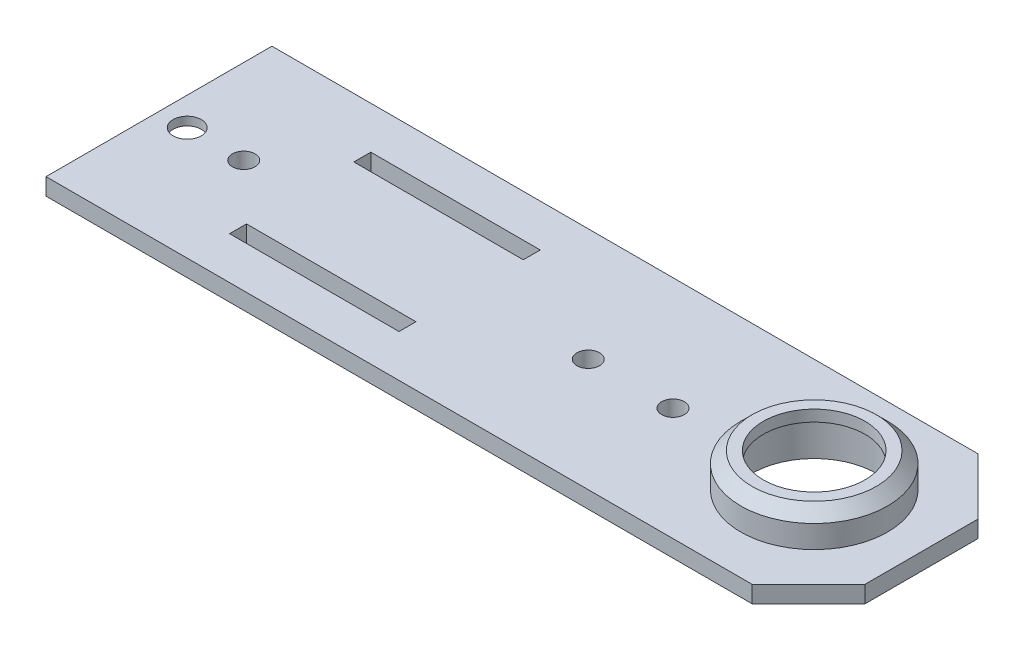
ISO-10303-21;
HEADER;
FILE_DESCRIPTION(('STEP AP214'),'2;1');
FILE_NAME('part.step','',(''),(''),'','','');
FILE_SCHEMA(('AUTOMOTIVE_DESIGN { 1 0 10303 214 1 1 1 1 }'));
ENDSEC;
DATA;
#1=APPLICATION_CONTEXT('core data for automotive mechanical design processes');
#2=APPLICATION_PROTOCOL_DEFINITION('international standard','automotive_design',2000,#1);
#3=PRODUCT_CONTEXT('',#1,'mechanical');
#4=PRODUCT('Part','Part','',(#3));
#5=PRODUCT_RELATED_PRODUCT_CATEGORY('part','',(#4));
#6=PRODUCT_DEFINITION_FORMATION('','',#4);
#7=PRODUCT_DEFINITION_CONTEXT('part definition',#1,'design');
#8=PRODUCT_DEFINITION('design','',#6,#7);
#9=PRODUCT_DEFINITION_SHAPE('','',#8);
#10=(LENGTH_UNIT() NAMED_UNIT(*) SI_UNIT(.MILLI.,.METRE.));
#11=(NAMED_UNIT(*) PLANE_ANGLE_UNIT() SI_UNIT($,.RADIAN.));
#12=(NAMED_UNIT(*) SI_UNIT($,.STERADIAN.) SOLID_ANGLE_UNIT());
#13=UNCERTAINTY_MEASURE_WITH_UNIT(LENGTH_MEASURE(1.E-05),#10,'distance_accuracy_value','');
#14=(GEOMETRIC_REPRESENTATION_CONTEXT(3) GLOBAL_UNCERTAINTY_ASSIGNED_CONTEXT((#13)) GLOBAL_UNIT_ASSIGNED_CONTEXT((#10,
#11,#12)) REPRESENTATION_CONTEXT('',''));
#15=CARTESIAN_POINT('',(0.,0.,0.));
#16=DIRECTION('',(0.,0.,1.));
#17=DIRECTION('',(1.,0.,0.));
#18=AXIS2_PLACEMENT_3D('',#15,#16,#17);
#19=CARTESIAN_POINT('',(-57.5,3.,-10.0000000000001));
#20=DIRECTION('',(0.,0.,-1.));
#21=DIRECTION('',(-1.,0.,0.));
#22=AXIS2_PLACEMENT_3D('',#19,#20,#21);
#23=PLANE('',#22);
#24=DIRECTION('',(-1.,0.,0.));
#25=VECTOR('',#24,1.);
#26=CARTESIAN_POINT('',(-67.5,1.5,-10.0000000000001));
#27=LINE('',#26,#25);
#28=CARTESIAN_POINT('',(-57.5,1.5,-10.0000000000001));
#29=VERTEX_POINT('',#28);
#30=CARTESIAN_POINT('',(-67.5,1.5,-10.0000000000001));
#31=VERTEX_POINT('',#30);
#32=EDGE_CURVE('E171',#29,#31,#27,.T.);
#33=ORIENTED_EDGE('',*,*,#32,.T.);
#34=DIRECTION('',(0.,-1.,0.));
#35=VECTOR('',#34,1.);
#36=CARTESIAN_POINT('',(-67.5,3.,-10.0000000000001));
#37=LINE('',#36,#35);
#38=CARTESIAN_POINT('',(-67.5,0.,-10.0000000000001));
#39=VERTEX_POINT('',#38);
#40=EDGE_CURVE('E189',#31,#39,#37,.T.);
#41=ORIENTED_EDGE('',*,*,#40,.T.);
#42=DIRECTION('',(1.,0.,0.));
#43=VECTOR('',#42,1.);
#44=CARTESIAN_POINT('',(-57.5,0.,-10.0000000000001));
#45=LINE('',#44,#43);
#46=CARTESIAN_POINT('',(-57.5,0.,-10.0000000000001));
#47=VERTEX_POINT('',#46);
#48=EDGE_CURVE('E267',#39,#47,#45,.T.);
#49=ORIENTED_EDGE('',*,*,#48,.T.);
#50=DIRECTION('',(0.,-1.,0.));
#51=VECTOR('',#50,1.);
#52=CARTESIAN_POINT('',(-57.5,3.,-10.0000000000001));
#53=LINE('',#52,#51);
#54=EDGE_CURVE('E187',#29,#47,#53,.T.);
#55=ORIENTED_EDGE('',*,*,#54,.F.);
#56=EDGE_LOOP('',(#33,#41,#49,#55));
#57=FACE_BOUND('',#56,.T.);
#58=ADVANCED_FACE('F39',(#57),#23,.F.);
#59=CARTESIAN_POINT('',(-57.5,3.,9.99999999999992));
#60=DIRECTION('',(1.,0.,0.));
#61=DIRECTION('',(0.,0.,-1.));
#62=AXIS2_PLACEMENT_3D('',#59,#60,#61);
#63=PLANE('',#62);
#64=DIRECTION('',(0.,0.,-1.));
#65=VECTOR('',#64,1.);
#66=CARTESIAN_POINT('',(-57.5,1.5,-10.0000000000001));
#67=LINE('',#66,#65);
#68=CARTESIAN_POINT('',(-57.5,1.5,9.99999999999992));
#69=VERTEX_POINT('',#68);
#70=EDGE_CURVE('E165',#69,#29,#67,.T.);
#71=ORIENTED_EDGE('',*,*,#70,.T.);
#72=ORIENTED_EDGE('',*,*,#54,.T.);
#73=DIRECTION('',(0.,0.,1.));
#74=VECTOR('',#73,1.);
#75=CARTESIAN_POINT('',(-57.5,0.,9.99999999999992));
#76=LINE('',#75,#74);
#77=CARTESIAN_POINT('',(-57.5,0.,9.99999999999992));
#78=VERTEX_POINT('',#77);
#79=EDGE_CURVE('E185',#47,#78,#76,.T.);
#80=ORIENTED_EDGE('',*,*,#79,.T.);
#81=DIRECTION('',(0.,-1.,0.));
#82=VECTOR('',#81,1.);
#83=CARTESIAN_POINT('',(-57.5,3.,9.99999999999992));
#84=LINE('',#83,#82);
#85=EDGE_CURVE('E179',#69,#78,#84,.T.);
#86=ORIENTED_EDGE('',*,*,#85,.F.);
#87=EDGE_LOOP('',(#71,#72,#80,#86));
#88=FACE_BOUND('',#87,.T.);
#89=ADVANCED_FACE('F183',(#88),#63,.F.);
#90=CARTESIAN_POINT('',(-67.5,3.,9.99999999999992));
#91=DIRECTION('',(0.,0.,1.));
#92=DIRECTION('',(1.,0.,0.));
#93=AXIS2_PLACEMENT_3D('',#90,#91,#92);
#94=PLANE('',#93);
#95=DIRECTION('',(1.,0.,0.));
#96=VECTOR('',#95,1.);
#97=CARTESIAN_POINT('',(-67.5,1.5,9.99999999999992));
#98=LINE('',#97,#96);
#99=CARTESIAN_POINT('',(-67.5,1.5,9.99999999999992));
#100=VERTEX_POINT('',#99);
#101=EDGE_CURVE('E168',#100,#69,#98,.T.);
#102=ORIENTED_EDGE('',*,*,#101,.T.);
#103=ORIENTED_EDGE('',*,*,#85,.T.);
#104=DIRECTION('',(-1.,0.,0.));
#105=VECTOR('',#104,1.);
#106=CARTESIAN_POINT('',(-67.5,0.,9.99999999999992));
#107=LINE('',#106,#105);
#108=CARTESIAN_POINT('',(-67.5,0.,9.99999999999992));
#109=VERTEX_POINT('',#108);
#110=EDGE_CURVE('E252',#78,#109,#107,.T.);
#111=ORIENTED_EDGE('',*,*,#110,.T.);
#112=DIRECTION('',(0.,-1.,0.));
#113=VECTOR('',#112,1.);
#114=CARTESIAN_POINT('',(-67.5,3.,9.99999999999992));
#115=LINE('',#114,#113);
#116=EDGE_CURVE('E181',#100,#109,#115,.T.);
#117=ORIENTED_EDGE('',*,*,#116,.F.);
#118=EDGE_LOOP('',(#102,#103,#111,#117));
#119=FACE_BOUND('',#118,.T.);
#120=ADVANCED_FACE('F177',(#119),#94,.F.);
#121=CARTESIAN_POINT('',(0.,3.,0.));
#122=DIRECTION('',(0.,-1.,0.));
#123=DIRECTION('',(0.,0.,-1.));
#124=AXIS2_PLACEMENT_3D('',#121,#122,#123);
#125=PLANE('',#124);
#126=DIRECTION('',(0.,0.,-1.));
#127=VECTOR('',#126,1.);
#128=CARTESIAN_POINT('',(-12.5,3.,12.5));
#129=LINE('',#128,#127);
#130=CARTESIAN_POINT('',(-12.5,3.,12.5));
#131=VERTEX_POINT('',#130);
#132=CARTESIAN_POINT('',(-12.5,3.,9.5));
#133=VERTEX_POINT('',#132);
#134=EDGE_CURVE('E292',#131,#133,#129,.T.);
#135=ORIENTED_EDGE('',*,*,#134,.F.);
#136=DIRECTION('',(1.,0.,0.));
#137=VECTOR('',#136,1.);
#138=CARTESIAN_POINT('',(-42.5,3.,12.5));
#139=LINE('',#138,#137);
#140=CARTESIAN_POINT('',(-42.5,3.,12.5));
#141=VERTEX_POINT('',#140);
#142=EDGE_CURVE('E300',#141,#131,#139,.T.);
#143=ORIENTED_EDGE('',*,*,#142,.F.);
#144=DIRECTION('',(0.,0.,1.));
#145=VECTOR('',#144,1.);
#146=CARTESIAN_POINT('',(-42.5,3.,12.5));
#147=LINE('',#146,#145);
#148=CARTESIAN_POINT('',(-42.5,3.,9.5));
#149=VERTEX_POINT('',#148);
#150=EDGE_CURVE('E297',#149,#141,#147,.T.);
#151=ORIENTED_EDGE('',*,*,#150,.F.);
#152=DIRECTION('',(-1.,0.,0.));
#153=VECTOR('',#152,1.);
#154=CARTESIAN_POINT('',(-42.5,3.,9.5));
#155=LINE('',#154,#153);
#156=EDGE_CURVE('E294',#133,#149,#155,.T.);
#157=ORIENTED_EDGE('',*,*,#156,.F.);
#158=EDGE_LOOP('',(#135,#143,#151,#157));
#159=FACE_BOUND('',#158,.T.);
#160=CARTESIAN_POINT('',(8.49999999999999,3.,0.));
#161=DIRECTION('',(0.,1.,0.));
#162=DIRECTION('',(0.,0.,1.));
#163=AXIS2_PLACEMENT_3D('',#160,#161,#162);
#164=CIRCLE('',#163,2.);
#165=CARTESIAN_POINT('',(8.49999999999999,3.,2.));
#166=VERTEX_POINT('',#165);
#167=EDGE_CURVE('E363',#166,#166,#164,.T.);
#168=ORIENTED_EDGE('',*,*,#167,.F.);
#169=EDGE_LOOP('',(#168));
#170=FACE_BOUND('',#169,.T.);
#171=CARTESIAN_POINT('',(23.5,3.,0.));
#172=DIRECTION('',(0.,1.,0.));
#173=DIRECTION('',(0.,0.,1.));
#174=AXIS2_PLACEMENT_3D('',#171,#172,#173);
#175=CIRCLE('',#174,2.);
#176=CARTESIAN_POINT('',(23.5,3.,2.00000000000001));
#177=VERTEX_POINT('',#176);
#178=EDGE_CURVE('E262',#177,#177,#175,.T.);
#179=ORIENTED_EDGE('',*,*,#178,.F.);
#180=EDGE_LOOP('',(#179));
#181=FACE_BOUND('',#180,.T.);
#182=DIRECTION('',(1.,0.,0.));
#183=VECTOR('',#182,1.);
#184=CARTESIAN_POINT('',(-67.5,3.,20.));
#185=LINE('',#184,#183);
#186=CARTESIAN_POINT('',(-67.5,3.,20.));
#187=VERTEX_POINT('',#186);
#188=CARTESIAN_POINT('',(57.5,3.,20.));
#189=VERTEX_POINT('',#188);
#190=EDGE_CURVE('E226',#187,#189,#185,.T.);
#191=ORIENTED_EDGE('',*,*,#190,.T.);
#192=DIRECTION('',(-0.707106781186549,0.,0.707106781186547));
#193=VECTOR('',#192,1.);
#194=CARTESIAN_POINT('',(67.5,3.,9.99999999999999));
#195=LINE('',#194,#193);
#196=CARTESIAN_POINT('',(67.5,3.,9.99999999999999));
#197=VERTEX_POINT('',#196);
#198=EDGE_CURVE('E48',#189,#197,#195,.F.);
#199=ORIENTED_EDGE('',*,*,#198,.T.);
#200=DIRECTION('',(0.,0.,-1.));
#201=VECTOR('',#200,1.);
#202=CARTESIAN_POINT('',(67.5,3.,20.));
#203=LINE('',#202,#201);
#204=CARTESIAN_POINT('',(67.5,3.,-9.99999999999995));
#205=VERTEX_POINT('',#204);
#206=EDGE_CURVE('E224',#197,#205,#203,.T.);
#207=ORIENTED_EDGE('',*,*,#206,.T.);
#208=DIRECTION('',(0.707106781186546,0.,0.707106781186549));
#209=VECTOR('',#208,1.);
#210=CARTESIAN_POINT('',(57.5,3.,-20.));
#211=LINE('',#210,#209);
#212=CARTESIAN_POINT('',(57.5,3.,-20.));
#213=VERTEX_POINT('',#212);
#214=EDGE_CURVE('E63',#205,#213,#211,.F.);
#215=ORIENTED_EDGE('',*,*,#214,.T.);
#216=DIRECTION('',(-1.,0.,0.));
#217=VECTOR('',#216,1.);
#218=CARTESIAN_POINT('',(-67.5,3.,-20.));
#219=LINE('',#218,#217);
#220=CARTESIAN_POINT('',(-67.5,3.,-20.));
#221=VERTEX_POINT('',#220);
#222=EDGE_CURVE('E235',#213,#221,#219,.T.);
#223=ORIENTED_EDGE('',*,*,#222,.T.);
#224=DIRECTION('',(0.,0.,1.));
#225=VECTOR('',#224,1.);
#226=CARTESIAN_POINT('',(-67.5,3.,-10.0000000000001));
#227=LINE('',#226,#225);
#228=EDGE_CURVE('E255',#221,#187,#227,.T.);
#229=ORIENTED_EDGE('',*,*,#228,.T.);
#230=EDGE_LOOP('',(#191,#199,#207,#215,#223,#229));
#231=FACE_BOUND('',#230,.T.);
#232=DIRECTION('',(0.,0.,-1.));
#233=VECTOR('',#232,1.);
#234=CARTESIAN_POINT('',(-12.5,3.,-9.5));
#235=LINE('',#234,#233);
#236=CARTESIAN_POINT('',(-12.5,3.,-9.5));
#237=VERTEX_POINT('',#236);
#238=CARTESIAN_POINT('',(-12.5,3.,-12.5));
#239=VERTEX_POINT('',#238);
#240=EDGE_CURVE('E329',#237,#239,#235,.T.);
#241=ORIENTED_EDGE('',*,*,#240,.F.);
#242=DIRECTION('',(1.,0.,0.));
#243=VECTOR('',#242,1.);
#244=CARTESIAN_POINT('',(-42.5,3.,-9.5));
#245=LINE('',#244,#243);
#246=CARTESIAN_POINT('',(-42.5,3.,-9.5));
#247=VERTEX_POINT('',#246);
#248=EDGE_CURVE('E337',#247,#237,#245,.T.);
#249=ORIENTED_EDGE('',*,*,#248,.F.);
#250=DIRECTION('',(0.,0.,1.));
#251=VECTOR('',#250,1.);
#252=CARTESIAN_POINT('',(-42.5,3.,-9.5));
#253=LINE('',#252,#251);
#254=CARTESIAN_POINT('',(-42.5,3.,-12.5));
#255=VERTEX_POINT('',#254);
#256=EDGE_CURVE('E334',#255,#247,#253,.T.);
#257=ORIENTED_EDGE('',*,*,#256,.F.);
#258=DIRECTION('',(-1.,0.,0.));
#259=VECTOR('',#258,1.);
#260=CARTESIAN_POINT('',(-42.5,3.,-12.5));
#261=LINE('',#260,#259);
#262=EDGE_CURVE('E331',#239,#255,#261,.T.);
#263=ORIENTED_EDGE('',*,*,#262,.F.);
#264=EDGE_LOOP('',(#241,#249,#257,#263));
#265=FACE_BOUND('',#264,.T.);
#266=CARTESIAN_POINT('',(-52.5,3.,0.));
#267=DIRECTION('',(0.,1.,0.));
#268=DIRECTION('',(0.,0.,1.));
#269=AXIS2_PLACEMENT_3D('',#266,#267,#268);
#270=CIRCLE('',#269,2.);
#271=CARTESIAN_POINT('',(-52.5,3.,2.));
#272=VERTEX_POINT('',#271);
#273=EDGE_CURVE('E323',#272,#272,#270,.T.);
#274=ORIENTED_EDGE('',*,*,#273,.F.);
#275=EDGE_LOOP('',(#274));
#276=FACE_BOUND('',#275,.T.);
#277=CARTESIAN_POINT('',(48.5,3.,0.));
#278=DIRECTION('',(0.,-1.,0.));
#279=DIRECTION('',(0.,0.,-1.));
#280=AXIS2_PLACEMENT_3D('',#277,#278,#279);
#281=CIRCLE('',#280,13.);
#282=CARTESIAN_POINT('',(48.5,3.,-13.));
#283=VERTEX_POINT('',#282);
#284=EDGE_CURVE('E199',#283,#283,#281,.F.);
#285=ORIENTED_EDGE('',*,*,#284,.F.);
#286=EDGE_LOOP('',(#285));
#287=FACE_BOUND('',#286,.T.);
#288=CARTESIAN_POINT('',(-62.5,3.,0.));
#289=DIRECTION('',(0.,1.,0.));
#290=DIRECTION('',(0.,0.,1.));
#291=AXIS2_PLACEMENT_3D('',#288,#289,#290);
#292=CIRCLE('',#291,2.5);
#293=CARTESIAN_POINT('',(-62.5,3.,2.49999999999993));
#294=VERTEX_POINT('',#293);
#295=EDGE_CURVE('E756',#294,#294,#292,.T.);
#296=ORIENTED_EDGE('',*,*,#295,.F.);
#297=EDGE_LOOP('',(#296));
#298=FACE_BOUND('',#297,.T.);
#299=ADVANCED_FACE('F222',(#159,#170,#181,#231,#265,#276,#287,#298),#125,.F.);
#300=CARTESIAN_POINT('',(0.,0.,0.));
#301=DIRECTION('',(0.,-1.,0.));
#302=DIRECTION('',(0.,0.,-1.));
#303=AXIS2_PLACEMENT_3D('',#300,#301,#302);
#304=PLANE('',#303);
#305=DIRECTION('',(1.,0.,0.));
#306=VECTOR('',#305,1.);
#307=CARTESIAN_POINT('',(-42.5,0.,-9.5));
#308=LINE('',#307,#306);
#309=CARTESIAN_POINT('',(-42.5,0.,-9.5));
#310=VERTEX_POINT('',#309);
#311=CARTESIAN_POINT('',(-12.5,0.,-9.5));
#312=VERTEX_POINT('',#311);
#313=EDGE_CURVE('E332',#310,#312,#308,.T.);
#314=ORIENTED_EDGE('',*,*,#313,.T.);
#315=DIRECTION('',(0.,0.,-1.));
#316=VECTOR('',#315,1.);
#317=CARTESIAN_POINT('',(-12.5,0.,-9.5));
#318=LINE('',#317,#316);
#319=CARTESIAN_POINT('',(-12.5,0.,-12.5));
#320=VERTEX_POINT('',#319);
#321=EDGE_CURVE('E326',#312,#320,#318,.T.);
#322=ORIENTED_EDGE('',*,*,#321,.T.);
#323=DIRECTION('',(-1.,0.,0.));
#324=VECTOR('',#323,1.);
#325=CARTESIAN_POINT('',(-42.5,0.,-12.5));
#326=LINE('',#325,#324);
#327=CARTESIAN_POINT('',(-42.5,0.,-12.5));
#328=VERTEX_POINT('',#327);
#329=EDGE_CURVE('E342',#320,#328,#326,.T.);
#330=ORIENTED_EDGE('',*,*,#329,.T.);
#331=DIRECTION('',(0.,0.,1.));
#332=VECTOR('',#331,1.);
#333=CARTESIAN_POINT('',(-42.5,0.,-9.5));
#334=LINE('',#333,#332);
#335=EDGE_CURVE('E345',#328,#310,#334,.T.);
#336=ORIENTED_EDGE('',*,*,#335,.T.);
#337=EDGE_LOOP('',(#314,#322,#330,#336));
#338=FACE_BOUND('',#337,.T.);
#339=CARTESIAN_POINT('',(48.5,0.,0.));
#340=DIRECTION('',(0.,1.,0.));
#341=DIRECTION('',(0.,0.,1.));
#342=AXIS2_PLACEMENT_3D('',#339,#340,#341);
#343=CIRCLE('',#342,11.);
#344=CARTESIAN_POINT('',(48.5,0.,11.));
#345=VERTEX_POINT('',#344);
#346=EDGE_CURVE('E359',#345,#345,#343,.T.);
#347=ORIENTED_EDGE('',*,*,#346,.T.);
#348=EDGE_LOOP('',(#347));
#349=FACE_BOUND('',#348,.T.);
#350=CARTESIAN_POINT('',(23.5,0.,0.));
#351=DIRECTION('',(0.,1.,0.));
#352=DIRECTION('',(0.,0.,1.));
#353=AXIS2_PLACEMENT_3D('',#350,#351,#352);
#354=CIRCLE('',#353,2.);
#355=CARTESIAN_POINT('',(23.5,0.,2.00000000000001));
#356=VERTEX_POINT('',#355);
#357=EDGE_CURVE('E366',#356,#356,#354,.T.);
#358=ORIENTED_EDGE('',*,*,#357,.T.);
#359=EDGE_LOOP('',(#358));
#360=FACE_BOUND('',#359,.T.);
#361=DIRECTION('',(0.,0.,-1.));
#362=VECTOR('',#361,1.);
#363=CARTESIAN_POINT('',(67.5,0.,20.));
#364=LINE('',#363,#362);
#365=CARTESIAN_POINT('',(67.5,0.,9.99999999999999));
#366=VERTEX_POINT('',#365);
#367=CARTESIAN_POINT('',(67.5,0.,-9.99999999999995));
#368=VERTEX_POINT('',#367);
#369=EDGE_CURVE('E245',#366,#368,#364,.T.);
#370=ORIENTED_EDGE('',*,*,#369,.F.);
#371=DIRECTION('',(0.707106781186549,0.,-0.707106781186547));
#372=VECTOR('',#371,1.);
#373=CARTESIAN_POINT('',(38.7499999999999,0.,38.75));
#374=LINE('',#373,#372);
#375=CARTESIAN_POINT('',(57.5,0.,20.));
#376=VERTEX_POINT('',#375);
#377=EDGE_CURVE('E215',#366,#376,#374,.F.);
#378=ORIENTED_EDGE('',*,*,#377,.T.);
#379=DIRECTION('',(1.,0.,0.));
#380=VECTOR('',#379,1.);
#381=CARTESIAN_POINT('',(-67.5,0.,20.));
#382=LINE('',#381,#380);
#383=CARTESIAN_POINT('',(-67.5,0.,20.));
#384=VERTEX_POINT('',#383);
#385=EDGE_CURVE('E236',#384,#376,#382,.T.);
#386=ORIENTED_EDGE('',*,*,#385,.F.);
#387=DIRECTION('',(0.,0.,1.));
#388=VECTOR('',#387,1.);
#389=CARTESIAN_POINT('',(-67.5,0.,20.));
#390=LINE('',#389,#388);
#391=EDGE_CURVE('E250',#109,#384,#390,.T.);
#392=ORIENTED_EDGE('',*,*,#391,.F.);
#393=ORIENTED_EDGE('',*,*,#110,.F.);
#394=ORIENTED_EDGE('',*,*,#79,.F.);
#395=ORIENTED_EDGE('',*,*,#48,.F.);
#396=DIRECTION('',(0.,0.,1.));
#397=VECTOR('',#396,1.);
#398=CARTESIAN_POINT('',(-67.5,0.,-10.0000000000001));
#399=LINE('',#398,#397);
#400=CARTESIAN_POINT('',(-67.5,0.,-20.));
#401=VERTEX_POINT('',#400);
#402=EDGE_CURVE('E264',#401,#39,#399,.T.);
#403=ORIENTED_EDGE('',*,*,#402,.F.);
#404=DIRECTION('',(-1.,0.,0.));
#405=VECTOR('',#404,1.);
#406=CARTESIAN_POINT('',(-67.5,0.,-20.));
#407=LINE('',#406,#405);
#408=CARTESIAN_POINT('',(57.5,0.,-20.));
#409=VERTEX_POINT('',#408);
#410=EDGE_CURVE('E261',#409,#401,#407,.T.);
#411=ORIENTED_EDGE('',*,*,#410,.F.);
#412=DIRECTION('',(-0.707106781186546,0.,-0.707106781186549));
#413=VECTOR('',#412,1.);
#414=CARTESIAN_POINT('',(38.7500000000001,0.,-38.75));
#415=LINE('',#414,#413);
#416=EDGE_CURVE('E213',#409,#368,#415,.F.);
#417=ORIENTED_EDGE('',*,*,#416,.T.);
#418=EDGE_LOOP('',(#370,#378,#386,#392,#393,#394,#395,#403,#411,#417));
#419=FACE_BOUND('',#418,.T.);
#420=CARTESIAN_POINT('',(8.49999999999999,0.,0.));
#421=DIRECTION('',(0.,1.,0.));
#422=DIRECTION('',(0.,0.,1.));
#423=AXIS2_PLACEMENT_3D('',#420,#421,#422);
#424=CIRCLE('',#423,2.);
#425=CARTESIAN_POINT('',(8.49999999999999,0.,2.));
#426=VERTEX_POINT('',#425);
#427=EDGE_CURVE('E362',#426,#426,#424,.T.);
#428=ORIENTED_EDGE('',*,*,#427,.T.);
#429=EDGE_LOOP('',(#428));
#430=FACE_BOUND('',#429,.T.);
#431=CARTESIAN_POINT('',(-52.5,0.,0.));
#432=DIRECTION('',(0.,1.,0.));
#433=DIRECTION('',(0.,0.,1.));
#434=AXIS2_PLACEMENT_3D('',#431,#432,#433);
#435=CIRCLE('',#434,2.);
#436=CARTESIAN_POINT('',(-52.5,0.,2.));
#437=VERTEX_POINT('',#436);
#438=EDGE_CURVE('E322',#437,#437,#435,.T.);
#439=ORIENTED_EDGE('',*,*,#438,.T.);
#440=EDGE_LOOP('',(#439));
#441=FACE_BOUND('',#440,.T.);
#442=DIRECTION('',(1.,0.,0.));
#443=VECTOR('',#442,1.);
#444=CARTESIAN_POINT('',(-42.5,0.,12.5));
#445=LINE('',#444,#443);
#446=CARTESIAN_POINT('',(-42.5,0.,12.5));
#447=VERTEX_POINT('',#446);
#448=CARTESIAN_POINT('',(-12.5,0.,12.5));
#449=VERTEX_POINT('',#448);
#450=EDGE_CURVE('E295',#447,#449,#445,.T.);
#451=ORIENTED_EDGE('',*,*,#450,.T.);
#452=DIRECTION('',(0.,0.,-1.));
#453=VECTOR('',#452,1.);
#454=CARTESIAN_POINT('',(-12.5,0.,12.5));
#455=LINE('',#454,#453);
#456=CARTESIAN_POINT('',(-12.5,0.,9.5));
#457=VERTEX_POINT('',#456);
#458=EDGE_CURVE('E291',#449,#457,#455,.T.);
#459=ORIENTED_EDGE('',*,*,#458,.T.);
#460=DIRECTION('',(-1.,0.,0.));
#461=VECTOR('',#460,1.);
#462=CARTESIAN_POINT('',(-42.5,0.,9.5));
#463=LINE('',#462,#461);
#464=CARTESIAN_POINT('',(-42.5,0.,9.5));
#465=VERTEX_POINT('',#464);
#466=EDGE_CURVE('E305',#457,#465,#463,.T.);
#467=ORIENTED_EDGE('',*,*,#466,.T.);
#468=DIRECTION('',(0.,0.,1.));
#469=VECTOR('',#468,1.);
#470=CARTESIAN_POINT('',(-42.5,0.,12.5));
#471=LINE('',#470,#469);
#472=EDGE_CURVE('E308',#465,#447,#471,.T.);
#473=ORIENTED_EDGE('',*,*,#472,.T.);
#474=EDGE_LOOP('',(#451,#459,#467,#473));
#475=FACE_BOUND('',#474,.T.);
#476=ADVANCED_FACE('F242',(#338,#349,#360,#419,#430,#441,#475),#304,.T.);
#477=CARTESIAN_POINT('',(67.5,3.,20.));
#478=DIRECTION('',(-1.,0.,0.));
#479=DIRECTION('',(0.,0.,1.));
#480=AXIS2_PLACEMENT_3D('',#477,#478,#479);
#481=PLANE('',#480);
#482=ORIENTED_EDGE('',*,*,#206,.F.);
#483=DIRECTION('',(0.,-1.,0.));
#484=VECTOR('',#483,1.);
#485=CARTESIAN_POINT('',(67.5,3.,9.99999999999999));
#486=LINE('',#485,#484);
#487=EDGE_CURVE('E210',#197,#366,#486,.T.);
#488=ORIENTED_EDGE('',*,*,#487,.T.);
#489=ORIENTED_EDGE('',*,*,#369,.T.);
#490=DIRECTION('',(0.,1.,0.));
#491=VECTOR('',#490,1.);
#492=CARTESIAN_POINT('',(67.5,3.,-9.99999999999995));
#493=LINE('',#492,#491);
#494=EDGE_CURVE('E208',#368,#205,#493,.T.);
#495=ORIENTED_EDGE('',*,*,#494,.T.);
#496=EDGE_LOOP('',(#482,#488,#489,#495));
#497=FACE_BOUND('',#496,.T.);
#498=ADVANCED_FACE('F231',(#497),#481,.F.);
#499=CARTESIAN_POINT('',(-67.5,3.,-20.));
#500=DIRECTION('',(0.,0.,1.));
#501=DIRECTION('',(1.,0.,0.));
#502=AXIS2_PLACEMENT_3D('',#499,#500,#501);
#503=PLANE('',#502);
#504=ORIENTED_EDGE('',*,*,#222,.F.);
#505=DIRECTION('',(0.,-1.,0.));
#506=VECTOR('',#505,1.);
#507=CARTESIAN_POINT('',(57.5,3.,-20.));
#508=LINE('',#507,#506);
#509=EDGE_CURVE('E11',#213,#409,#508,.T.);
#510=ORIENTED_EDGE('',*,*,#509,.T.);
#511=ORIENTED_EDGE('',*,*,#410,.T.);
#512=DIRECTION('',(0.,-1.,0.));
#513=VECTOR('',#512,1.);
#514=CARTESIAN_POINT('',(-67.5,3.,-20.));
#515=LINE('',#514,#513);
#516=EDGE_CURVE('E196',#221,#401,#515,.T.);
#517=ORIENTED_EDGE('',*,*,#516,.F.);
#518=EDGE_LOOP('',(#504,#510,#511,#517));
#519=FACE_BOUND('',#518,.T.);
#520=ADVANCED_FACE('F276',(#519),#503,.F.);
#521=CARTESIAN_POINT('',(-67.5,3.,20.));
#522=DIRECTION('',(1.,0.,0.));
#523=DIRECTION('',(0.,0.,-1.));
#524=AXIS2_PLACEMENT_3D('',#521,#522,#523);
#525=PLANE('',#524);
#526=ORIENTED_EDGE('',*,*,#391,.T.);
#527=DIRECTION('',(0.,-1.,0.));
#528=VECTOR('',#527,1.);
#529=CARTESIAN_POINT('',(-67.5,3.,20.));
#530=LINE('',#529,#528);
#531=EDGE_CURVE('E191',#187,#384,#530,.T.);
#532=ORIENTED_EDGE('',*,*,#531,.F.);
#533=ORIENTED_EDGE('',*,*,#228,.F.);
#534=ORIENTED_EDGE('',*,*,#516,.T.);
#535=ORIENTED_EDGE('',*,*,#402,.T.);
#536=ORIENTED_EDGE('',*,*,#40,.F.);
#537=DIRECTION('',(0.,0.,1.));
#538=VECTOR('',#537,1.);
#539=CARTESIAN_POINT('',(-67.5,1.5,-10.0000000000001));
#540=LINE('',#539,#538);
#541=EDGE_CURVE('E55',#31,#100,#540,.T.);
#542=ORIENTED_EDGE('',*,*,#541,.T.);
#543=ORIENTED_EDGE('',*,*,#116,.T.);
#544=EDGE_LOOP('',(#526,#532,#533,#534,#535,#536,#542,#543));
#545=FACE_BOUND('',#544,.T.);
#546=ADVANCED_FACE('F270',(#545),#525,.F.);
#547=CARTESIAN_POINT('',(-67.5,3.,20.));
#548=DIRECTION('',(0.,0.,-1.));
#549=DIRECTION('',(-1.,0.,0.));
#550=AXIS2_PLACEMENT_3D('',#547,#548,#549);
#551=PLANE('',#550);
#552=ORIENTED_EDGE('',*,*,#385,.T.);
#553=DIRECTION('',(0.,1.,0.));
#554=VECTOR('',#553,1.);
#555=CARTESIAN_POINT('',(57.5,3.,20.));
#556=LINE('',#555,#554);
#557=EDGE_CURVE('E217',#376,#189,#556,.T.);
#558=ORIENTED_EDGE('',*,*,#557,.T.);
#559=ORIENTED_EDGE('',*,*,#190,.F.);
#560=ORIENTED_EDGE('',*,*,#531,.T.);
#561=EDGE_LOOP('',(#552,#558,#559,#560));
#562=FACE_BOUND('',#561,.T.);
#563=ADVANCED_FACE('F248',(#562),#551,.F.);
#564=CARTESIAN_POINT('',(23.5,3.,0.));
#565=DIRECTION('',(0.,-1.,0.));
#566=DIRECTION('',(0.,0.,-1.));
#567=AXIS2_PLACEMENT_3D('',#564,#565,#566);
#568=CYLINDRICAL_SURFACE('',#567,2.);
#569=ORIENTED_EDGE('',*,*,#178,.T.);
#570=EDGE_LOOP('',(#569));
#571=FACE_BOUND('',#570,.T.);
#572=ORIENTED_EDGE('',*,*,#357,.F.);
#573=EDGE_LOOP('',(#572));
#574=FACE_BOUND('',#573,.T.);
#575=ADVANCED_FACE('F375',(#571,#574),#568,.F.);
#576=CARTESIAN_POINT('',(8.49999999999999,3.,0.));
#577=DIRECTION('',(0.,-1.,0.));
#578=DIRECTION('',(0.,0.,-1.));
#579=AXIS2_PLACEMENT_3D('',#576,#577,#578);
#580=CYLINDRICAL_SURFACE('',#579,2.);
#581=ORIENTED_EDGE('',*,*,#167,.T.);
#582=EDGE_LOOP('',(#581));
#583=FACE_BOUND('',#582,.T.);
#584=ORIENTED_EDGE('',*,*,#427,.F.);
#585=EDGE_LOOP('',(#584));
#586=FACE_BOUND('',#585,.T.);
#587=ADVANCED_FACE('F377',(#583,#586),#580,.F.);
#588=CARTESIAN_POINT('',(48.5,3.,0.));
#589=DIRECTION('',(0.,-1.,0.));
#590=DIRECTION('',(0.,0.,-1.));
#591=AXIS2_PLACEMENT_3D('',#588,#589,#590);
#592=CYLINDRICAL_SURFACE('',#591,11.);
#593=ORIENTED_EDGE('',*,*,#346,.F.);
#594=EDGE_LOOP('',(#593));
#595=FACE_BOUND('',#594,.T.);
#596=CARTESIAN_POINT('',(48.5,7.,0.));
#597=DIRECTION('',(0.,1.,0.));
#598=DIRECTION('',(0.,0.,1.));
#599=AXIS2_PLACEMENT_3D('',#596,#597,#598);
#600=CIRCLE('',#599,11.);
#601=CARTESIAN_POINT('',(48.5,7.,11.));
#602=VERTEX_POINT('',#601);
#603=EDGE_CURVE('E287',#602,#602,#600,.T.);
#604=ORIENTED_EDGE('',*,*,#603,.T.);
#605=EDGE_LOOP('',(#604));
#606=FACE_BOUND('',#605,.T.);
#607=ADVANCED_FACE('F384',(#595,#606),#592,.F.);
#608=CARTESIAN_POINT('',(-12.5,3.,-9.5));
#609=DIRECTION('',(-1.,0.,0.));
#610=DIRECTION('',(0.,0.,1.));
#611=AXIS2_PLACEMENT_3D('',#608,#609,#610);
#612=PLANE('',#611);
#613=ORIENTED_EDGE('',*,*,#321,.F.);
#614=DIRECTION('',(0.,-1.,0.));
#615=VECTOR('',#614,1.);
#616=CARTESIAN_POINT('',(-12.5,3.,-9.5));
#617=LINE('',#616,#615);
#618=EDGE_CURVE('E339',#237,#312,#617,.T.);
#619=ORIENTED_EDGE('',*,*,#618,.F.);
#620=ORIENTED_EDGE('',*,*,#240,.T.);
#621=DIRECTION('',(0.,-1.,0.));
#622=VECTOR('',#621,1.);
#623=CARTESIAN_POINT('',(-12.5,3.,-12.5));
#624=LINE('',#623,#622);
#625=EDGE_CURVE('E356',#239,#320,#624,.T.);
#626=ORIENTED_EDGE('',*,*,#625,.T.);
#627=EDGE_LOOP('',(#613,#619,#620,#626));
#628=FACE_BOUND('',#627,.T.);
#629=ADVANCED_FACE('F475',(#628),#612,.T.);
#630=CARTESIAN_POINT('',(-42.5,3.,-12.5));
#631=DIRECTION('',(0.,0.,1.));
#632=DIRECTION('',(1.,0.,0.));
#633=AXIS2_PLACEMENT_3D('',#630,#631,#632);
#634=PLANE('',#633);
#635=ORIENTED_EDGE('',*,*,#329,.F.);
#636=ORIENTED_EDGE('',*,*,#625,.F.);
#637=ORIENTED_EDGE('',*,*,#262,.T.);
#638=DIRECTION('',(0.,-1.,0.));
#639=VECTOR('',#638,1.);
#640=CARTESIAN_POINT('',(-42.5,3.,-12.5));
#641=LINE('',#640,#639);
#642=EDGE_CURVE('E354',#255,#328,#641,.T.);
#643=ORIENTED_EDGE('',*,*,#642,.T.);
#644=EDGE_LOOP('',(#635,#636,#637,#643));
#645=FACE_BOUND('',#644,.T.);
#646=ADVANCED_FACE('F471',(#645),#634,.T.);
#647=CARTESIAN_POINT('',(-42.5,3.,-9.5));
#648=DIRECTION('',(1.,0.,0.));
#649=DIRECTION('',(0.,0.,-1.));
#650=AXIS2_PLACEMENT_3D('',#647,#648,#649);
#651=PLANE('',#650);
#652=ORIENTED_EDGE('',*,*,#335,.F.);
#653=ORIENTED_EDGE('',*,*,#642,.F.);
#654=ORIENTED_EDGE('',*,*,#256,.T.);
#655=DIRECTION('',(0.,-1.,0.));
#656=VECTOR('',#655,1.);
#657=CARTESIAN_POINT('',(-42.5,3.,-9.5));
#658=LINE('',#657,#656);
#659=EDGE_CURVE('E352',#247,#310,#658,.T.);
#660=ORIENTED_EDGE('',*,*,#659,.T.);
#661=EDGE_LOOP('',(#652,#653,#654,#660));
#662=FACE_BOUND('',#661,.T.);
#663=ADVANCED_FACE('F467',(#662),#651,.T.);
#664=CARTESIAN_POINT('',(-42.5,3.,-9.5));
#665=DIRECTION('',(0.,0.,-1.));
#666=DIRECTION('',(-1.,0.,0.));
#667=AXIS2_PLACEMENT_3D('',#664,#665,#666);
#668=PLANE('',#667);
#669=ORIENTED_EDGE('',*,*,#313,.F.);
#670=ORIENTED_EDGE('',*,*,#659,.F.);
#671=ORIENTED_EDGE('',*,*,#248,.T.);
#672=ORIENTED_EDGE('',*,*,#618,.T.);
#673=EDGE_LOOP('',(#669,#670,#671,#672));
#674=FACE_BOUND('',#673,.T.);
#675=ADVANCED_FACE('F463',(#674),#668,.T.);
#676=CARTESIAN_POINT('',(-52.5,3.,0.));
#677=DIRECTION('',(0.,-1.,0.));
#678=DIRECTION('',(0.,0.,-1.));
#679=AXIS2_PLACEMENT_3D('',#676,#677,#678);
#680=CYLINDRICAL_SURFACE('',#679,2.);
#681=ORIENTED_EDGE('',*,*,#273,.T.);
#682=EDGE_LOOP('',(#681));
#683=FACE_BOUND('',#682,.T.);
#684=ORIENTED_EDGE('',*,*,#438,.F.);
#685=EDGE_LOOP('',(#684));
#686=FACE_BOUND('',#685,.T.);
#687=ADVANCED_FACE('F459',(#683,#686),#680,.F.);
#688=CARTESIAN_POINT('',(-12.5,3.,12.5));
#689=DIRECTION('',(-1.,0.,0.));
#690=DIRECTION('',(0.,0.,1.));
#691=AXIS2_PLACEMENT_3D('',#688,#689,#690);
#692=PLANE('',#691);
#693=ORIENTED_EDGE('',*,*,#458,.F.);
#694=DIRECTION('',(0.,-1.,0.));
#695=VECTOR('',#694,1.);
#696=CARTESIAN_POINT('',(-12.5,3.,12.5));
#697=LINE('',#696,#695);
#698=EDGE_CURVE('E302',#131,#449,#697,.T.);
#699=ORIENTED_EDGE('',*,*,#698,.F.);
#700=ORIENTED_EDGE('',*,*,#134,.T.);
#701=DIRECTION('',(0.,-1.,0.));
#702=VECTOR('',#701,1.);
#703=CARTESIAN_POINT('',(-12.5,3.,9.5));
#704=LINE('',#703,#702);
#705=EDGE_CURVE('E319',#133,#457,#704,.T.);
#706=ORIENTED_EDGE('',*,*,#705,.T.);
#707=EDGE_LOOP('',(#693,#699,#700,#706));
#708=FACE_BOUND('',#707,.T.);
#709=ADVANCED_FACE('F455',(#708),#692,.T.);
#710=CARTESIAN_POINT('',(-42.5,3.,9.5));
#711=DIRECTION('',(0.,0.,1.));
#712=DIRECTION('',(1.,0.,0.));
#713=AXIS2_PLACEMENT_3D('',#710,#711,#712);
#714=PLANE('',#713);
#715=ORIENTED_EDGE('',*,*,#466,.F.);
#716=ORIENTED_EDGE('',*,*,#705,.F.);
#717=ORIENTED_EDGE('',*,*,#156,.T.);
#718=DIRECTION('',(0.,-1.,0.));
#719=VECTOR('',#718,1.);
#720=CARTESIAN_POINT('',(-42.5,3.,9.5));
#721=LINE('',#720,#719);
#722=EDGE_CURVE('E317',#149,#465,#721,.T.);
#723=ORIENTED_EDGE('',*,*,#722,.T.);
#724=EDGE_LOOP('',(#715,#716,#717,#723));
#725=FACE_BOUND('',#724,.T.);
#726=ADVANCED_FACE('F451',(#725),#714,.T.);
#727=CARTESIAN_POINT('',(-42.5,3.,12.5));
#728=DIRECTION('',(1.,0.,0.));
#729=DIRECTION('',(0.,0.,-1.));
#730=AXIS2_PLACEMENT_3D('',#727,#728,#729);
#731=PLANE('',#730);
#732=ORIENTED_EDGE('',*,*,#472,.F.);
#733=ORIENTED_EDGE('',*,*,#722,.F.);
#734=ORIENTED_EDGE('',*,*,#150,.T.);
#735=DIRECTION('',(0.,-1.,0.));
#736=VECTOR('',#735,1.);
#737=CARTESIAN_POINT('',(-42.5,3.,12.5));
#738=LINE('',#737,#736);
#739=EDGE_CURVE('E315',#141,#447,#738,.T.);
#740=ORIENTED_EDGE('',*,*,#739,.T.);
#741=EDGE_LOOP('',(#732,#733,#734,#740));
#742=FACE_BOUND('',#741,.T.);
#743=ADVANCED_FACE('F447',(#742),#731,.T.);
#744=CARTESIAN_POINT('',(-42.5,3.,12.5));
#745=DIRECTION('',(0.,0.,-1.));
#746=DIRECTION('',(-1.,0.,0.));
#747=AXIS2_PLACEMENT_3D('',#744,#745,#746);
#748=PLANE('',#747);
#749=ORIENTED_EDGE('',*,*,#450,.F.);
#750=ORIENTED_EDGE('',*,*,#739,.F.);
#751=ORIENTED_EDGE('',*,*,#142,.T.);
#752=ORIENTED_EDGE('',*,*,#698,.T.);
#753=EDGE_LOOP('',(#749,#750,#751,#752));
#754=FACE_BOUND('',#753,.T.);
#755=ADVANCED_FACE('F443',(#754),#748,.T.);
#756=CARTESIAN_POINT('',(48.5,7.,0.));
#757=DIRECTION('',(0.,-1.,0.));
#758=DIRECTION('',(0.,0.,-1.));
#759=AXIS2_PLACEMENT_3D('',#756,#757,#758);
#760=CYLINDRICAL_SURFACE('',#759,13.);
#761=CARTESIAN_POINT('',(48.5,7.00000000000001,0.));
#762=DIRECTION('',(0.,1.,0.));
#763=DIRECTION('',(0.,0.,1.));
#764=AXIS2_PLACEMENT_3D('',#761,#762,#763);
#765=CIRCLE('',#764,13.);
#766=CARTESIAN_POINT('',(48.5,7.00000000000001,13.));
#767=VERTEX_POINT('',#766);
#768=EDGE_CURVE('E205',#767,#767,#765,.F.);
#769=ORIENTED_EDGE('',*,*,#768,.T.);
#770=EDGE_LOOP('',(#769));
#771=FACE_BOUND('',#770,.T.);
#772=ORIENTED_EDGE('',*,*,#284,.T.);
#773=EDGE_LOOP('',(#772));
#774=FACE_BOUND('',#773,.T.);
#775=ADVANCED_FACE('F439',(#771,#774),#760,.T.);
#776=CARTESIAN_POINT('',(48.5,7.,0.));
#777=DIRECTION('',(0.,1.,0.));
#778=DIRECTION('',(0.,0.,1.));
#779=AXIS2_PLACEMENT_3D('',#776,#777,#778);
#780=PLANE('',#779);
#781=CARTESIAN_POINT('',(48.5,7.,0.));
#782=DIRECTION('',(0.,1.,0.));
#783=DIRECTION('',(0.,0.,1.));
#784=AXIS2_PLACEMENT_3D('',#781,#782,#783);
#785=CIRCLE('',#784,9.);
#786=CARTESIAN_POINT('',(48.5,7.,9.));
#787=VERTEX_POINT('',#786);
#788=EDGE_CURVE('E280',#787,#787,#785,.T.);
#789=ORIENTED_EDGE('',*,*,#788,.T.);
#790=EDGE_LOOP('',(#789));
#791=FACE_BOUND('',#790,.T.);
#792=ORIENTED_EDGE('',*,*,#603,.F.);
#793=EDGE_LOOP('',(#792));
#794=FACE_BOUND('',#793,.T.);
#795=ADVANCED_FACE('F435',(#791,#794),#780,.F.);
#796=CARTESIAN_POINT('',(48.5,9.,0.));
#797=DIRECTION('',(0.,1.,0.));
#798=DIRECTION('',(0.,0.,1.));
#799=AXIS2_PLACEMENT_3D('',#796,#797,#798);
#800=PLANE('',#799);
#801=CARTESIAN_POINT('',(48.5,9.,0.));
#802=DIRECTION('',(0.,1.,0.));
#803=DIRECTION('',(0.,0.,1.));
#804=AXIS2_PLACEMENT_3D('',#801,#802,#803);
#805=CIRCLE('',#804,11.);
#806=CARTESIAN_POINT('',(48.5,9.,11.));
#807=VERTEX_POINT('',#806);
#808=EDGE_CURVE('E202',#807,#807,#805,.T.);
#809=ORIENTED_EDGE('',*,*,#808,.T.);
#810=EDGE_LOOP('',(#809));
#811=FACE_BOUND('',#810,.T.);
#812=CARTESIAN_POINT('',(48.5,9.,0.));
#813=DIRECTION('',(0.,1.,0.));
#814=DIRECTION('',(0.,0.,1.));
#815=AXIS2_PLACEMENT_3D('',#812,#813,#814);
#816=CIRCLE('',#815,9.);
#817=CARTESIAN_POINT('',(48.5,9.,9.));
#818=VERTEX_POINT('',#817);
#819=EDGE_CURVE('E283',#818,#818,#816,.T.);
#820=ORIENTED_EDGE('',*,*,#819,.F.);
#821=EDGE_LOOP('',(#820));
#822=FACE_BOUND('',#821,.T.);
#823=ADVANCED_FACE('F431',(#811,#822),#800,.T.);
#824=CARTESIAN_POINT('',(48.5,9.,0.));
#825=DIRECTION('',(0.,-1.,0.));
#826=DIRECTION('',(0.,0.,-1.));
#827=AXIS2_PLACEMENT_3D('',#824,#825,#826);
#828=CYLINDRICAL_SURFACE('',#827,9.);
#829=ORIENTED_EDGE('',*,*,#819,.T.);
#830=EDGE_LOOP('',(#829));
#831=FACE_BOUND('',#830,.T.);
#832=ORIENTED_EDGE('',*,*,#788,.F.);
#833=EDGE_LOOP('',(#832));
#834=FACE_BOUND('',#833,.T.);
#835=ADVANCED_FACE('F407',(#831,#834),#828,.F.);
#836=CARTESIAN_POINT('',(48.5,9.,0.));
#837=DIRECTION('',(0.,-1.,0.));
#838=DIRECTION('',(0.,0.,-1.));
#839=AXIS2_PLACEMENT_3D('',#836,#837,#838);
#840=CONICAL_SURFACE('',#839,11.,0.785398163397447);
#841=ORIENTED_EDGE('',*,*,#768,.F.);
#842=EDGE_LOOP('',(#841));
#843=FACE_BOUND('',#842,.T.);
#844=ORIENTED_EDGE('',*,*,#808,.F.);
#845=EDGE_LOOP('',(#844));
#846=FACE_BOUND('',#845,.T.);
#847=ADVANCED_FACE('F402',(#843,#846),#840,.T.);
#848=CARTESIAN_POINT('',(67.5,3.,9.99999999999999));
#849=DIRECTION('',(-0.707106781186547,0.,-0.707106781186549));
#850=DIRECTION('',(0.,-1.,0.));
#851=AXIS2_PLACEMENT_3D('',#848,#849,#850);
#852=PLANE('',#851);
#853=ORIENTED_EDGE('',*,*,#198,.F.);
#854=ORIENTED_EDGE('',*,*,#557,.F.);
#855=ORIENTED_EDGE('',*,*,#377,.F.);
#856=ORIENTED_EDGE('',*,*,#487,.F.);
#857=EDGE_LOOP('',(#853,#854,#855,#856));
#858=FACE_BOUND('',#857,.T.);
#859=ADVANCED_FACE('F238',(#858),#852,.F.);
#860=CARTESIAN_POINT('',(57.5,3.,-20.));
#861=DIRECTION('',(-0.707106781186549,0.,0.707106781186546));
#862=DIRECTION('',(0.,-1.,0.));
#863=AXIS2_PLACEMENT_3D('',#860,#861,#862);
#864=PLANE('',#863);
#865=ORIENTED_EDGE('',*,*,#214,.F.);
#866=ORIENTED_EDGE('',*,*,#494,.F.);
#867=ORIENTED_EDGE('',*,*,#416,.F.);
#868=ORIENTED_EDGE('',*,*,#509,.F.);
#869=EDGE_LOOP('',(#865,#866,#867,#868));
#870=FACE_BOUND('',#869,.T.);
#871=ADVANCED_FACE('F42',(#870),#864,.F.);
#872=CARTESIAN_POINT('',(0.,1.5,0.));
#873=DIRECTION('',(0.,1.,0.));
#874=DIRECTION('',(0.,0.,1.));
#875=AXIS2_PLACEMENT_3D('',#872,#873,#874);
#876=PLANE('',#875);
#877=CARTESIAN_POINT('',(-62.5,1.5,0.));
#878=DIRECTION('',(0.,1.,0.));
#879=DIRECTION('',(0.,0.,1.));
#880=AXIS2_PLACEMENT_3D('',#877,#878,#879);
#881=CIRCLE('',#880,2.5);
#882=CARTESIAN_POINT('',(-62.5,1.5,2.49999999999993));
#883=VERTEX_POINT('',#882);
#884=EDGE_CURVE('E758',#883,#883,#881,.T.);
#885=ORIENTED_EDGE('',*,*,#884,.T.);
#886=EDGE_LOOP('',(#885));
#887=FACE_BOUND('',#886,.T.);
#888=ORIENTED_EDGE('',*,*,#541,.F.);
#889=ORIENTED_EDGE('',*,*,#32,.F.);
#890=ORIENTED_EDGE('',*,*,#70,.F.);
#891=ORIENTED_EDGE('',*,*,#101,.F.);
#892=EDGE_LOOP('',(#888,#889,#890,#891));
#893=FACE_BOUND('',#892,.T.);
#894=ADVANCED_FACE('F167',(#887,#893),#876,.F.);
#895=CARTESIAN_POINT('',(-62.5,1.5,0.));
#896=DIRECTION('',(0.,1.,0.));
#897=DIRECTION('',(0.,0.,1.));
#898=AXIS2_PLACEMENT_3D('',#895,#896,#897);
#899=CYLINDRICAL_SURFACE('',#898,2.5);
#900=ORIENTED_EDGE('',*,*,#884,.F.);
#901=EDGE_LOOP('',(#900));
#902=FACE_BOUND('',#901,.T.);
#903=ORIENTED_EDGE('',*,*,#295,.T.);
#904=EDGE_LOOP('',(#903));
#905=FACE_BOUND('',#904,.T.);
#906=ADVANCED_FACE('F419',(#902,#905),#899,.F.);
#907=CLOSED_SHELL('',(#58,#89,#120,#299,#476,#498,#520,#546,#563,#575,#587,#607,#629,#646,#663,
#675,#687,#709,#726,#743,#755,#775,#795,#823,#835,#847,#859,#871,#894,#906));
#908=MANIFOLD_SOLID_BREP('B2',#907);
#909=ADVANCED_BREP_SHAPE_REPRESENTATION('',(#18,#908),#14);
#910=SHAPE_DEFINITION_REPRESENTATION(#9,#909);
ENDSEC;
END-ISO-10303-21;
